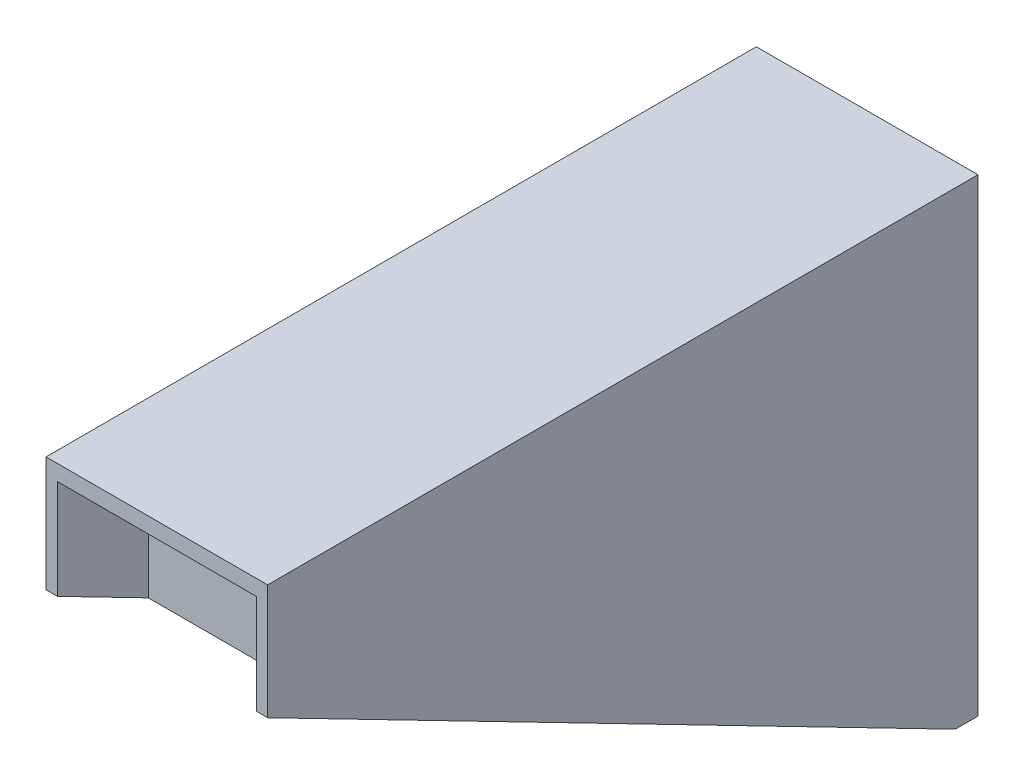
ISO-10303-21;
HEADER;
FILE_DESCRIPTION(('STEP AP214'),'2;1');
FILE_NAME('part.step','',(''),(''),'','','');
FILE_SCHEMA(('AUTOMOTIVE_DESIGN { 1 0 10303 214 1 1 1 1 }'));
ENDSEC;
DATA;
#1=APPLICATION_CONTEXT('core data for automotive mechanical design processes');
#2=APPLICATION_PROTOCOL_DEFINITION('international standard','automotive_design',2000,#1);
#3=PRODUCT_CONTEXT('',#1,'mechanical');
#4=PRODUCT('Part','Part','',(#3));
#5=PRODUCT_RELATED_PRODUCT_CATEGORY('part','',(#4));
#6=PRODUCT_DEFINITION_FORMATION('','',#4);
#7=PRODUCT_DEFINITION_CONTEXT('part definition',#1,'design');
#8=PRODUCT_DEFINITION('design','',#6,#7);
#9=PRODUCT_DEFINITION_SHAPE('','',#8);
#10=(LENGTH_UNIT() NAMED_UNIT(*) SI_UNIT(.MILLI.,.METRE.));
#11=(NAMED_UNIT(*) PLANE_ANGLE_UNIT() SI_UNIT($,.RADIAN.));
#12=(NAMED_UNIT(*) SI_UNIT($,.STERADIAN.) SOLID_ANGLE_UNIT());
#13=UNCERTAINTY_MEASURE_WITH_UNIT(LENGTH_MEASURE(1.E-05),#10,'distance_accuracy_value','');
#14=(GEOMETRIC_REPRESENTATION_CONTEXT(3) GLOBAL_UNCERTAINTY_ASSIGNED_CONTEXT((#13)) GLOBAL_UNIT_ASSIGNED_CONTEXT((#10,
#11,#12)) REPRESENTATION_CONTEXT('',''));
#15=CARTESIAN_POINT('',(0.,0.,0.));
#16=DIRECTION('',(0.,0.,1.));
#17=DIRECTION('',(1.,0.,0.));
#18=AXIS2_PLACEMENT_3D('',#15,#16,#17);
#19=CARTESIAN_POINT('',(-79.9333463940711,-38.3783834228314,250.));
#20=DIRECTION('',(-1.,0.,0.));
#21=DIRECTION('',(0.,-1.,0.));
#22=AXIS2_PLACEMENT_3D('',#19,#20,#21);
#23=PLANE('',#22);
#24=DIRECTION('',(0.,0.457472546618906,0.889223745235142));
#25=VECTOR('',#24,1.);
#26=CARTESIAN_POINT('',(-79.9333463940711,-78.8783834228314,250.));
#27=LINE('',#26,#25);
#28=CARTESIAN_POINT('',(-79.933346394071,-203.378383422831,8.));
#29=VERTEX_POINT('',#28);
#30=CARTESIAN_POINT('',(-79.933346394071,-78.8783834228314,250.));
#31=VERTEX_POINT('',#30);
#32=EDGE_CURVE('E104',#29,#31,#27,.T.);
#33=ORIENTED_EDGE('',*,*,#32,.F.);
#34=DIRECTION('',(0.,0.,-1.));
#35=VECTOR('',#34,1.);
#36=CARTESIAN_POINT('',(-79.9333463940711,-203.378383422831,250.));
#37=LINE('',#36,#35);
#38=CARTESIAN_POINT('',(-79.9333463940711,-203.378383422831,0.));
#39=VERTEX_POINT('',#38);
#40=EDGE_CURVE('E127',#29,#39,#37,.T.);
#41=ORIENTED_EDGE('',*,*,#40,.T.);
#42=DIRECTION('',(0.,1.,0.));
#43=VECTOR('',#42,1.);
#44=CARTESIAN_POINT('',(-79.9333463940711,-38.3783834228314,0.));
#45=LINE('',#44,#43);
#46=CARTESIAN_POINT('',(-79.9333463940711,-38.3783834228314,0.));
#47=VERTEX_POINT('',#46);
#48=EDGE_CURVE('E144',#39,#47,#45,.T.);
#49=ORIENTED_EDGE('',*,*,#48,.T.);
#50=DIRECTION('',(0.,0.,-1.));
#51=VECTOR('',#50,1.);
#52=CARTESIAN_POINT('',(-79.9333463940711,-38.3783834228314,250.));
#53=LINE('',#52,#51);
#54=CARTESIAN_POINT('',(-79.9333463940711,-38.3783834228314,250.));
#55=VERTEX_POINT('',#54);
#56=EDGE_CURVE('E123',#55,#47,#53,.T.);
#57=ORIENTED_EDGE('',*,*,#56,.F.);
#58=DIRECTION('',(0.,1.,0.));
#59=VECTOR('',#58,1.);
#60=CARTESIAN_POINT('',(-79.9333463940711,-38.3783834228314,250.));
#61=LINE('',#60,#59);
#62=EDGE_CURVE('E117',#31,#55,#61,.T.);
#63=ORIENTED_EDGE('',*,*,#62,.F.);
#64=EDGE_LOOP('',(#33,#41,#49,#57,#63));
#65=FACE_BOUND('',#64,.T.);
#66=ADVANCED_FACE('F35',(#65),#23,.F.);
#67=CARTESIAN_POINT('',(0.,0.,250.));
#68=DIRECTION('',(0.,0.,-1.));
#69=DIRECTION('',(-1.,0.,0.));
#70=AXIS2_PLACEMENT_3D('',#67,#68,#69);
#71=PLANE('',#70);
#72=DIRECTION('',(-1.,0.,0.));
#73=VECTOR('',#72,1.);
#74=CARTESIAN_POINT('',(399.479515242758,-78.8783834228313,250.));
#75=LINE('',#74,#73);
#76=CARTESIAN_POINT('',(-83.933346394071,-78.8783834228314,250.));
#77=VERTEX_POINT('',#76);
#78=EDGE_CURVE('E107',#31,#77,#75,.T.);
#79=ORIENTED_EDGE('',*,*,#78,.F.);
#80=ORIENTED_EDGE('',*,*,#62,.T.);
#81=DIRECTION('',(-1.,0.,0.));
#82=VECTOR('',#81,1.);
#83=CARTESIAN_POINT('',(-157.933346394071,-38.3783834228314,250.));
#84=LINE('',#83,#82);
#85=CARTESIAN_POINT('',(-157.933346394071,-38.3783834228314,250.));
#86=VERTEX_POINT('',#85);
#87=EDGE_CURVE('E130',#55,#86,#84,.T.);
#88=ORIENTED_EDGE('',*,*,#87,.T.);
#89=DIRECTION('',(0.,-1.,0.));
#90=VECTOR('',#89,1.);
#91=CARTESIAN_POINT('',(-157.933346394071,-203.378383422831,250.));
#92=LINE('',#91,#90);
#93=CARTESIAN_POINT('',(-157.933346394071,-78.8783834228313,250.));
#94=VERTEX_POINT('',#93);
#95=EDGE_CURVE('E125',#86,#94,#92,.T.);
#96=ORIENTED_EDGE('',*,*,#95,.T.);
#97=CARTESIAN_POINT('',(-153.933346394071,-78.8783834228314,250.));
#98=VERTEX_POINT('',#97);
#99=EDGE_CURVE('E120',#98,#94,#75,.T.);
#100=ORIENTED_EDGE('',*,*,#99,.F.);
#101=DIRECTION('',(0.,1.,0.));
#102=VECTOR('',#101,1.);
#103=CARTESIAN_POINT('',(-153.933346394071,-43.8783834228314,250.));
#104=LINE('',#103,#102);
#105=CARTESIAN_POINT('',(-153.933346394071,-43.8783834228314,250.));
#106=VERTEX_POINT('',#105);
#107=EDGE_CURVE('E175',#98,#106,#104,.T.);
#108=ORIENTED_EDGE('',*,*,#107,.T.);
#109=DIRECTION('',(1.,0.,0.));
#110=VECTOR('',#109,1.);
#111=CARTESIAN_POINT('',(-153.933346394071,-43.8783834228314,250.));
#112=LINE('',#111,#110);
#113=CARTESIAN_POINT('',(-83.9333463940711,-43.8783834228314,250.));
#114=VERTEX_POINT('',#113);
#115=EDGE_CURVE('E57',#106,#114,#112,.T.);
#116=ORIENTED_EDGE('',*,*,#115,.T.);
#117=DIRECTION('',(0.,-1.,0.));
#118=VECTOR('',#117,1.);
#119=CARTESIAN_POINT('',(-83.9333463940711,-43.8783834228314,250.));
#120=LINE('',#119,#118);
#121=EDGE_CURVE('E119',#114,#77,#120,.T.);
#122=ORIENTED_EDGE('',*,*,#121,.T.);
#123=EDGE_LOOP('',(#79,#80,#88,#96,#100,#108,#116,#122));
#124=FACE_BOUND('',#123,.T.);
#125=ADVANCED_FACE('F115',(#124),#71,.F.);
#126=CARTESIAN_POINT('',(-79.9333463940711,-203.378383422831,250.));
#127=DIRECTION('',(0.,1.,0.));
#128=DIRECTION('',(-1.,0.,0.));
#129=AXIS2_PLACEMENT_3D('',#126,#127,#128);
#130=PLANE('',#129);
#131=ORIENTED_EDGE('',*,*,#40,.F.);
#132=DIRECTION('',(-1.,0.,0.));
#133=VECTOR('',#132,1.);
#134=CARTESIAN_POINT('',(399.479515242758,-203.378383422831,8.));
#135=LINE('',#134,#133);
#136=CARTESIAN_POINT('',(-157.933346394071,-203.378383422831,7.99999999999998));
#137=VERTEX_POINT('',#136);
#138=EDGE_CURVE('E109',#29,#137,#135,.T.);
#139=ORIENTED_EDGE('',*,*,#138,.T.);
#140=DIRECTION('',(0.,0.,-1.));
#141=VECTOR('',#140,1.);
#142=CARTESIAN_POINT('',(-157.933346394071,-203.378383422831,250.));
#143=LINE('',#142,#141);
#144=CARTESIAN_POINT('',(-157.933346394071,-203.378383422831,0.));
#145=VERTEX_POINT('',#144);
#146=EDGE_CURVE('E147',#137,#145,#143,.T.);
#147=ORIENTED_EDGE('',*,*,#146,.T.);
#148=DIRECTION('',(1.,0.,0.));
#149=VECTOR('',#148,1.);
#150=CARTESIAN_POINT('',(-79.9333463940711,-203.378383422831,0.));
#151=LINE('',#150,#149);
#152=EDGE_CURVE('E141',#145,#39,#151,.T.);
#153=ORIENTED_EDGE('',*,*,#152,.T.);
#154=EDGE_LOOP('',(#131,#139,#147,#153));
#155=FACE_BOUND('',#154,.T.);
#156=ADVANCED_FACE('F161',(#155),#130,.F.);
#157=CARTESIAN_POINT('',(-157.933346394071,-38.3783834228314,250.));
#158=DIRECTION('',(0.,-1.,0.));
#159=DIRECTION('',(0.,0.,-1.));
#160=AXIS2_PLACEMENT_3D('',#157,#158,#159);
#161=PLANE('',#160);
#162=DIRECTION('',(-1.,0.,0.));
#163=VECTOR('',#162,1.);
#164=CARTESIAN_POINT('',(-157.933346394071,-38.3783834228314,0.));
#165=LINE('',#164,#163);
#166=CARTESIAN_POINT('',(-157.933346394071,-38.3783834228314,0.));
#167=VERTEX_POINT('',#166);
#168=EDGE_CURVE('E134',#47,#167,#165,.T.);
#169=ORIENTED_EDGE('',*,*,#168,.T.);
#170=DIRECTION('',(0.,0.,-1.));
#171=VECTOR('',#170,1.);
#172=CARTESIAN_POINT('',(-157.933346394071,-38.3783834228314,250.));
#173=LINE('',#172,#171);
#174=EDGE_CURVE('E43',#86,#167,#173,.T.);
#175=ORIENTED_EDGE('',*,*,#174,.F.);
#176=ORIENTED_EDGE('',*,*,#87,.F.);
#177=ORIENTED_EDGE('',*,*,#56,.T.);
#178=EDGE_LOOP('',(#169,#175,#176,#177));
#179=FACE_BOUND('',#178,.T.);
#180=ADVANCED_FACE('F37',(#179),#161,.F.);
#181=CARTESIAN_POINT('',(-157.933346394071,-203.378383422831,250.));
#182=DIRECTION('',(1.,0.,0.));
#183=DIRECTION('',(0.,0.,-1.));
#184=AXIS2_PLACEMENT_3D('',#181,#182,#183);
#185=PLANE('',#184);
#186=ORIENTED_EDGE('',*,*,#146,.F.);
#187=DIRECTION('',(0.,0.457472546618906,0.889223745235142));
#188=VECTOR('',#187,1.);
#189=CARTESIAN_POINT('',(-157.933346394071,-78.8783834228314,250.));
#190=LINE('',#189,#188);
#191=EDGE_CURVE('E113',#137,#94,#190,.T.);
#192=ORIENTED_EDGE('',*,*,#191,.T.);
#193=ORIENTED_EDGE('',*,*,#95,.F.);
#194=ORIENTED_EDGE('',*,*,#174,.T.);
#195=DIRECTION('',(0.,-1.,0.));
#196=VECTOR('',#195,1.);
#197=CARTESIAN_POINT('',(-157.933346394071,-203.378383422831,0.));
#198=LINE('',#197,#196);
#199=EDGE_CURVE('E137',#167,#145,#198,.T.);
#200=ORIENTED_EDGE('',*,*,#199,.T.);
#201=EDGE_LOOP('',(#186,#192,#193,#194,#200));
#202=FACE_BOUND('',#201,.T.);
#203=ADVANCED_FACE('F152',(#202),#185,.F.);
#204=CARTESIAN_POINT('',(0.,0.,0.));
#205=DIRECTION('',(0.,0.,-1.));
#206=DIRECTION('',(-1.,0.,0.));
#207=AXIS2_PLACEMENT_3D('',#204,#205,#206);
#208=PLANE('',#207);
#209=ORIENTED_EDGE('',*,*,#168,.F.);
#210=ORIENTED_EDGE('',*,*,#48,.F.);
#211=ORIENTED_EDGE('',*,*,#152,.F.);
#212=ORIENTED_EDGE('',*,*,#199,.F.);
#213=EDGE_LOOP('',(#209,#210,#211,#212));
#214=FACE_BOUND('',#213,.T.);
#215=ADVANCED_FACE('F159',(#214),#208,.T.);
#216=CARTESIAN_POINT('',(-153.933346394071,-43.8783834228314,949.412861636829));
#217=DIRECTION('',(1.,0.,0.));
#218=DIRECTION('',(0.,1.,0.));
#219=AXIS2_PLACEMENT_3D('',#216,#217,#218);
#220=PLANE('',#219);
#221=DIRECTION('',(0.,0.457472546618906,0.889223745235142));
#222=VECTOR('',#221,1.);
#223=CARTESIAN_POINT('',(-153.933346394071,212.964426816333,817.276787774118));
#224=LINE('',#223,#222);
#225=CARTESIAN_POINT('',(-153.933346394071,-95.3411933401867,218.));
#226=VERTEX_POINT('',#225);
#227=EDGE_CURVE('E177',#226,#98,#224,.T.);
#228=ORIENTED_EDGE('',*,*,#227,.F.);
#229=DIRECTION('',(0.,1.,0.));
#230=VECTOR('',#229,1.);
#231=CARTESIAN_POINT('',(-153.933346394071,-43.8783834228314,218.));
#232=LINE('',#231,#230);
#233=CARTESIAN_POINT('',(-153.933346394071,-43.8783834228314,218.));
#234=VERTEX_POINT('',#233);
#235=EDGE_CURVE('E171',#226,#234,#232,.T.);
#236=ORIENTED_EDGE('',*,*,#235,.T.);
#237=DIRECTION('',(0.,0.,-1.));
#238=VECTOR('',#237,1.);
#239=CARTESIAN_POINT('',(-153.933346394071,-43.8783834228314,949.412861636829));
#240=LINE('',#239,#238);
#241=EDGE_CURVE('E138',#106,#234,#240,.T.);
#242=ORIENTED_EDGE('',*,*,#241,.F.);
#243=ORIENTED_EDGE('',*,*,#107,.F.);
#244=EDGE_LOOP('',(#228,#236,#242,#243));
#245=FACE_BOUND('',#244,.T.);
#246=ADVANCED_FACE('F189',(#245),#220,.T.);
#247=CARTESIAN_POINT('',(-153.933346394071,-43.8783834228314,949.412861636829));
#248=DIRECTION('',(0.,-1.,0.));
#249=DIRECTION('',(0.,0.,-1.));
#250=AXIS2_PLACEMENT_3D('',#247,#248,#249);
#251=PLANE('',#250);
#252=ORIENTED_EDGE('',*,*,#115,.F.);
#253=ORIENTED_EDGE('',*,*,#241,.T.);
#254=DIRECTION('',(1.,0.,0.));
#255=VECTOR('',#254,1.);
#256=CARTESIAN_POINT('',(-153.933346394071,-43.8783834228314,218.));
#257=LINE('',#256,#255);
#258=CARTESIAN_POINT('',(-83.9333463940711,-43.8783834228314,218.));
#259=VERTEX_POINT('',#258);
#260=EDGE_CURVE('E178',#234,#259,#257,.T.);
#261=ORIENTED_EDGE('',*,*,#260,.T.);
#262=DIRECTION('',(0.,0.,-1.));
#263=VECTOR('',#262,1.);
#264=CARTESIAN_POINT('',(-83.9333463940711,-43.8783834228314,949.412861636829));
#265=LINE('',#264,#263);
#266=EDGE_CURVE('E168',#114,#259,#265,.T.);
#267=ORIENTED_EDGE('',*,*,#266,.F.);
#268=EDGE_LOOP('',(#252,#253,#261,#267));
#269=FACE_BOUND('',#268,.T.);
#270=ADVANCED_FACE('F196',(#269),#251,.T.);
#271=CARTESIAN_POINT('',(-83.9333463940711,-43.8783834228314,949.412861636829));
#272=DIRECTION('',(-1.,0.,0.));
#273=DIRECTION('',(0.,-1.,0.));
#274=AXIS2_PLACEMENT_3D('',#271,#272,#273);
#275=PLANE('',#274);
#276=DIRECTION('',(0.,-0.457472546618906,-0.889223745235142));
#277=VECTOR('',#276,1.);
#278=CARTESIAN_POINT('',(-83.9333463940712,212.964426816333,817.276787774118));
#279=LINE('',#278,#277);
#280=CARTESIAN_POINT('',(-83.9333463940711,-95.3411933401867,218.));
#281=VERTEX_POINT('',#280);
#282=EDGE_CURVE('E50',#77,#281,#279,.T.);
#283=ORIENTED_EDGE('',*,*,#282,.F.);
#284=ORIENTED_EDGE('',*,*,#121,.F.);
#285=ORIENTED_EDGE('',*,*,#266,.T.);
#286=DIRECTION('',(0.,-1.,0.));
#287=VECTOR('',#286,1.);
#288=CARTESIAN_POINT('',(-83.9333463940711,-43.8783834228314,218.));
#289=LINE('',#288,#287);
#290=EDGE_CURVE('E173',#259,#281,#289,.T.);
#291=ORIENTED_EDGE('',*,*,#290,.T.);
#292=EDGE_LOOP('',(#283,#284,#285,#291));
#293=FACE_BOUND('',#292,.T.);
#294=ADVANCED_FACE('F198',(#293),#275,.T.);
#295=CARTESIAN_POINT('',(0.,0.,218.));
#296=DIRECTION('',(0.,0.,-1.));
#297=DIRECTION('',(-1.,0.,0.));
#298=AXIS2_PLACEMENT_3D('',#295,#296,#297);
#299=PLANE('',#298);
#300=ORIENTED_EDGE('',*,*,#235,.F.);
#301=DIRECTION('',(1.,0.,0.));
#302=VECTOR('',#301,1.);
#303=CARTESIAN_POINT('',(0.,-95.3411933401867,218.));
#304=LINE('',#303,#302);
#305=EDGE_CURVE('E11',#226,#281,#304,.T.);
#306=ORIENTED_EDGE('',*,*,#305,.T.);
#307=ORIENTED_EDGE('',*,*,#290,.F.);
#308=ORIENTED_EDGE('',*,*,#260,.F.);
#309=EDGE_LOOP('',(#300,#306,#307,#308));
#310=FACE_BOUND('',#309,.T.);
#311=ADVANCED_FACE('F193',(#310),#299,.F.);
#312=CARTESIAN_POINT('',(399.479515242758,-78.8783834228313,250.));
#313=DIRECTION('',(0.,0.889223745235142,-0.457472546618906));
#314=DIRECTION('',(0.,0.457472546618906,0.889223745235142));
#315=AXIS2_PLACEMENT_3D('',#312,#313,#314);
#316=PLANE('',#315);
#317=ORIENTED_EDGE('',*,*,#305,.F.);
#318=ORIENTED_EDGE('',*,*,#227,.T.);
#319=ORIENTED_EDGE('',*,*,#99,.T.);
#320=ORIENTED_EDGE('',*,*,#191,.F.);
#321=ORIENTED_EDGE('',*,*,#138,.F.);
#322=ORIENTED_EDGE('',*,*,#32,.T.);
#323=ORIENTED_EDGE('',*,*,#78,.T.);
#324=ORIENTED_EDGE('',*,*,#282,.T.);
#325=EDGE_LOOP('',(#317,#318,#319,#320,#321,#322,#323,#324));
#326=FACE_BOUND('',#325,.T.);
#327=ADVANCED_FACE('F106',(#326),#316,.F.);
#328=CLOSED_SHELL('',(#66,#125,#156,#180,#203,#215,#246,#270,#294,#311,#327));
#329=MANIFOLD_SOLID_BREP('B2',#328);
#330=ADVANCED_BREP_SHAPE_REPRESENTATION('',(#18,#329),#14);
#331=SHAPE_DEFINITION_REPRESENTATION(#9,#330);
ENDSEC;
END-ISO-10303-21;
